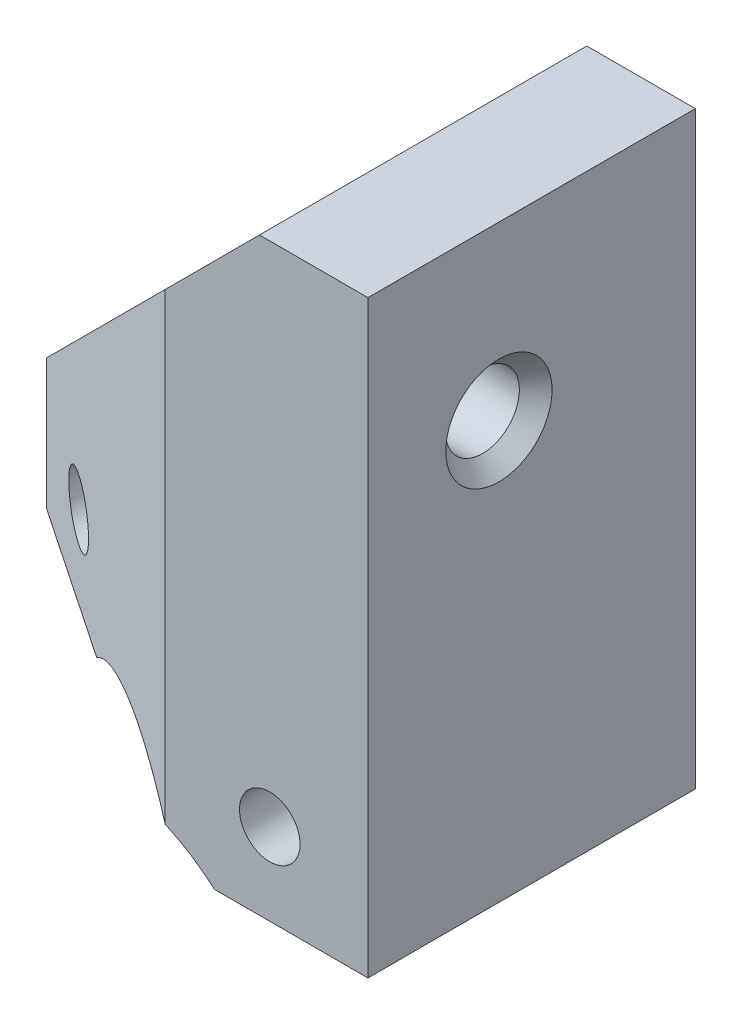
ISO-10303-21;
HEADER;
FILE_DESCRIPTION(('STEP AP214'),'2;1');
FILE_NAME('part.step','',(''),(''),'','','');
FILE_SCHEMA(('AUTOMOTIVE_DESIGN { 1 0 10303 214 1 1 1 1 }'));
ENDSEC;
DATA;
#1=APPLICATION_CONTEXT('core data for automotive mechanical design processes');
#2=APPLICATION_PROTOCOL_DEFINITION('international standard','automotive_design',2000,#1);
#3=PRODUCT_CONTEXT('',#1,'mechanical');
#4=PRODUCT('Part','Part','',(#3));
#5=PRODUCT_RELATED_PRODUCT_CATEGORY('part','',(#4));
#6=PRODUCT_DEFINITION_FORMATION('','',#4);
#7=PRODUCT_DEFINITION_CONTEXT('part definition',#1,'design');
#8=PRODUCT_DEFINITION('design','',#6,#7);
#9=PRODUCT_DEFINITION_SHAPE('','',#8);
#10=(LENGTH_UNIT() NAMED_UNIT(*) SI_UNIT(.MILLI.,.METRE.));
#11=(NAMED_UNIT(*) PLANE_ANGLE_UNIT() SI_UNIT($,.RADIAN.));
#12=(NAMED_UNIT(*) SI_UNIT($,.STERADIAN.) SOLID_ANGLE_UNIT());
#13=UNCERTAINTY_MEASURE_WITH_UNIT(LENGTH_MEASURE(1.E-05),#10,'distance_accuracy_value','');
#14=(GEOMETRIC_REPRESENTATION_CONTEXT(3) GLOBAL_UNCERTAINTY_ASSIGNED_CONTEXT((#13)) GLOBAL_UNIT_ASSIGNED_CONTEXT((#10,
#11,#12)) REPRESENTATION_CONTEXT('',''));
#15=CARTESIAN_POINT('',(0.,0.,0.));
#16=DIRECTION('',(0.,0.,1.));
#17=DIRECTION('',(1.,0.,0.));
#18=AXIS2_PLACEMENT_3D('',#15,#16,#17);
#19=CARTESIAN_POINT('',(-17.315,-5.,20.));
#20=DIRECTION('',(0.,1.,0.));
#21=DIRECTION('',(-1.,0.,0.));
#22=AXIS2_PLACEMENT_3D('',#19,#20,#21);
#23=PLANE('',#22);
#24=DIRECTION('',(0.,0.,1.));
#25=VECTOR('',#24,1.);
#26=CARTESIAN_POINT('',(-7.93725393319377,-5.,0.));
#27=LINE('',#26,#25);
#28=CARTESIAN_POINT('',(-7.93725393319377,-5.,0.));
#29=VERTEX_POINT('',#28);
#30=CARTESIAN_POINT('',(-7.93725393319377,-5.,11.3253695908464));
#31=VERTEX_POINT('',#30);
#32=EDGE_CURVE('E166',#29,#31,#27,.T.);
#33=ORIENTED_EDGE('',*,*,#32,.T.);
#34=DIRECTION('',(-0.829037572555041,0.,-0.559192903470748));
#35=VECTOR('',#34,1.);
#36=CARTESIAN_POINT('',(4.92341452769108,-5.,20.));
#37=LINE('',#36,#35);
#38=CARTESIAN_POINT('',(-17.315,-5.,4.99999999999997));
#39=VERTEX_POINT('',#38);
#40=EDGE_CURVE('E56',#31,#39,#37,.T.);
#41=ORIENTED_EDGE('',*,*,#40,.T.);
#42=DIRECTION('',(0.,0.,-1.));
#43=VECTOR('',#42,1.);
#44=CARTESIAN_POINT('',(-17.315,-5.,20.));
#45=LINE('',#44,#43);
#46=CARTESIAN_POINT('',(-17.315,-5.,0.));
#47=VERTEX_POINT('',#46);
#48=EDGE_CURVE('E149',#39,#47,#45,.T.);
#49=ORIENTED_EDGE('',*,*,#48,.T.);
#50=DIRECTION('',(1.,0.,0.));
#51=VECTOR('',#50,1.);
#52=CARTESIAN_POINT('',(-17.315,-5.,0.));
#53=LINE('',#52,#51);
#54=EDGE_CURVE('E122',#47,#29,#53,.T.);
#55=ORIENTED_EDGE('',*,*,#54,.T.);
#56=EDGE_LOOP('',(#33,#41,#49,#55));
#57=FACE_BOUND('',#56,.T.);
#58=ADVANCED_FACE('F33',(#57),#23,.F.);
#59=CARTESIAN_POINT('',(0.,0.,20.));
#60=DIRECTION('',(0.,0.,1.));
#61=DIRECTION('',(1.,0.,0.));
#62=AXIS2_PLACEMENT_3D('',#59,#60,#61);
#63=PLANE('',#62);
#64=DIRECTION('',(-0.707106781186546,-0.707106781186549,0.));
#65=VECTOR('',#64,1.);
#66=CARTESIAN_POINT('',(-10.1575,10.1574999999999,20.));
#67=LINE('',#66,#65);
#68=CARTESIAN_POINT('',(10.685,31.,20.));
#69=VERTEX_POINT('',#68);
#70=CARTESIAN_POINT('',(4.92341452769107,25.2384145276911,20.));
#71=VERTEX_POINT('',#70);
#72=EDGE_CURVE('E175',#69,#71,#67,.T.);
#73=ORIENTED_EDGE('',*,*,#72,.T.);
#74=DIRECTION('',(0.,-1.,0.));
#75=VECTOR('',#74,1.);
#76=CARTESIAN_POINT('',(4.92341452769108,-5.,20.));
#77=LINE('',#76,#75);
#78=CARTESIAN_POINT('',(4.92341452769108,-3.05650926858708,20.));
#79=VERTEX_POINT('',#78);
#80=EDGE_CURVE('E181',#71,#79,#77,.T.);
#81=ORIENTED_EDGE('',*,*,#80,.T.);
#82=CARTESIAN_POINT('',(0.,-14.,20.));
#83=DIRECTION('',(0.,0.,1.));
#84=DIRECTION('',(1.,0.,0.));
#85=AXIS2_PLACEMENT_3D('',#82,#83,#84);
#86=CIRCLE('',#85,12.);
#87=CARTESIAN_POINT('',(7.93725393319378,-5.,20.));
#88=VERTEX_POINT('',#87);
#89=EDGE_CURVE('E127',#88,#79,#86,.T.);
#90=ORIENTED_EDGE('',*,*,#89,.F.);
#91=DIRECTION('',(1.,0.,0.));
#92=VECTOR('',#91,1.);
#93=CARTESIAN_POINT('',(-17.315,-5.,20.));
#94=LINE('',#93,#92);
#95=CARTESIAN_POINT('',(17.315,-5.,20.));
#96=VERTEX_POINT('',#95);
#97=EDGE_CURVE('E118',#88,#96,#94,.T.);
#98=ORIENTED_EDGE('',*,*,#97,.T.);
#99=DIRECTION('',(0.,1.,0.));
#100=VECTOR('',#99,1.);
#101=CARTESIAN_POINT('',(17.315,5.,20.));
#102=LINE('',#101,#100);
#103=CARTESIAN_POINT('',(17.315,31.,20.));
#104=VERTEX_POINT('',#103);
#105=EDGE_CURVE('E113',#96,#104,#102,.T.);
#106=ORIENTED_EDGE('',*,*,#105,.T.);
#107=DIRECTION('',(1.,0.,0.));
#108=VECTOR('',#107,1.);
#109=CARTESIAN_POINT('',(-17.315,31.,20.));
#110=LINE('',#109,#108);
#111=EDGE_CURVE('E99',#69,#104,#110,.T.);
#112=ORIENTED_EDGE('',*,*,#111,.F.);
#113=EDGE_LOOP('',(#73,#81,#90,#98,#106,#112));
#114=FACE_BOUND('',#113,.T.);
#115=CARTESIAN_POINT('',(11.315,0.,20.));
#116=DIRECTION('',(0.,0.,1.));
#117=DIRECTION('',(1.,0.,0.));
#118=AXIS2_PLACEMENT_3D('',#115,#116,#117);
#119=CIRCLE('',#118,1.85);
#120=CARTESIAN_POINT('',(13.165,0.,20.));
#121=VERTEX_POINT('',#120);
#122=EDGE_CURVE('E135',#121,#121,#119,.T.);
#123=ORIENTED_EDGE('',*,*,#122,.F.);
#124=EDGE_LOOP('',(#123));
#125=FACE_BOUND('',#124,.T.);
#126=ADVANCED_FACE('F114',(#114,#125),#63,.T.);
#127=CARTESIAN_POINT('',(0.,0.,0.));
#128=DIRECTION('',(0.,0.,1.));
#129=DIRECTION('',(1.,0.,0.));
#130=AXIS2_PLACEMENT_3D('',#127,#128,#129);
#131=PLANE('',#130);
#132=CARTESIAN_POINT('',(-11.315,0.,0.));
#133=DIRECTION('',(0.,0.,1.));
#134=DIRECTION('',(1.,0.,0.));
#135=AXIS2_PLACEMENT_3D('',#132,#133,#134);
#136=CIRCLE('',#135,2.85);
#137=CARTESIAN_POINT('',(-8.465,0.,0.));
#138=VERTEX_POINT('',#137);
#139=EDGE_CURVE('E154',#138,#138,#136,.T.);
#140=ORIENTED_EDGE('',*,*,#139,.T.);
#141=EDGE_LOOP('',(#140));
#142=FACE_BOUND('',#141,.T.);
#143=CARTESIAN_POINT('',(11.315,0.,0.));
#144=DIRECTION('',(0.,0.,1.));
#145=DIRECTION('',(1.,0.,0.));
#146=AXIS2_PLACEMENT_3D('',#143,#144,#145);
#147=CIRCLE('',#146,2.85);
#148=CARTESIAN_POINT('',(14.165,0.,0.));
#149=VERTEX_POINT('',#148);
#150=EDGE_CURVE('E151',#149,#149,#147,.T.);
#151=ORIENTED_EDGE('',*,*,#150,.T.);
#152=EDGE_LOOP('',(#151));
#153=FACE_BOUND('',#152,.T.);
#154=DIRECTION('',(0.,-1.,0.));
#155=VECTOR('',#154,1.);
#156=CARTESIAN_POINT('',(-17.315,5.,0.));
#157=LINE('',#156,#155);
#158=CARTESIAN_POINT('',(-17.315,2.9999999999999,0.));
#159=VERTEX_POINT('',#158);
#160=EDGE_CURVE('E142',#159,#47,#157,.T.);
#161=ORIENTED_EDGE('',*,*,#160,.F.);
#162=DIRECTION('',(0.707106781186546,0.707106781186549,0.));
#163=VECTOR('',#162,1.);
#164=CARTESIAN_POINT('',(10.685,31.,0.));
#165=LINE('',#164,#163);
#166=CARTESIAN_POINT('',(10.685,31.,0.));
#167=VERTEX_POINT('',#166);
#168=EDGE_CURVE('E179',#159,#167,#165,.T.);
#169=ORIENTED_EDGE('',*,*,#168,.T.);
#170=DIRECTION('',(-1.,0.,0.));
#171=VECTOR('',#170,1.);
#172=CARTESIAN_POINT('',(17.315,31.,0.));
#173=LINE('',#172,#171);
#174=CARTESIAN_POINT('',(17.315,31.,0.));
#175=VERTEX_POINT('',#174);
#176=EDGE_CURVE('E110',#175,#167,#173,.T.);
#177=ORIENTED_EDGE('',*,*,#176,.F.);
#178=DIRECTION('',(0.,1.,0.));
#179=VECTOR('',#178,1.);
#180=CARTESIAN_POINT('',(17.315,5.,0.));
#181=LINE('',#180,#179);
#182=CARTESIAN_POINT('',(17.315,-5.,0.));
#183=VERTEX_POINT('',#182);
#184=EDGE_CURVE('E126',#183,#175,#181,.T.);
#185=ORIENTED_EDGE('',*,*,#184,.F.);
#186=CARTESIAN_POINT('',(7.93725393319377,-5.,0.));
#187=VERTEX_POINT('',#186);
#188=EDGE_CURVE('E145',#187,#183,#53,.T.);
#189=ORIENTED_EDGE('',*,*,#188,.F.);
#190=CARTESIAN_POINT('',(0.,-14.,0.));
#191=DIRECTION('',(0.,0.,1.));
#192=DIRECTION('',(1.,0.,0.));
#193=AXIS2_PLACEMENT_3D('',#190,#191,#192);
#194=CIRCLE('',#193,12.);
#195=EDGE_CURVE('E130',#187,#29,#194,.T.);
#196=ORIENTED_EDGE('',*,*,#195,.T.);
#197=ORIENTED_EDGE('',*,*,#54,.F.);
#198=EDGE_LOOP('',(#161,#169,#177,#185,#189,#196,#197));
#199=FACE_BOUND('',#198,.T.);
#200=ADVANCED_FACE('F206',(#142,#153,#199),#131,.F.);
#201=CARTESIAN_POINT('',(17.315,5.,20.));
#202=DIRECTION('',(-1.,0.,0.));
#203=DIRECTION('',(0.,0.,1.));
#204=AXIS2_PLACEMENT_3D('',#201,#202,#203);
#205=PLANE('',#204);
#206=CARTESIAN_POINT('',(17.315,20.5,12.));
#207=DIRECTION('',(-1.,0.,0.));
#208=DIRECTION('',(0.,0.,1.));
#209=AXIS2_PLACEMENT_3D('',#206,#207,#208);
#210=CIRCLE('',#209,3.25000000000001);
#211=CARTESIAN_POINT('',(17.315,20.5,15.25));
#212=VERTEX_POINT('',#211);
#213=EDGE_CURVE('E171',#212,#212,#210,.T.);
#214=ORIENTED_EDGE('',*,*,#213,.T.);
#215=EDGE_LOOP('',(#214));
#216=FACE_BOUND('',#215,.T.);
#217=ORIENTED_EDGE('',*,*,#184,.T.);
#218=DIRECTION('',(0.,0.,-1.));
#219=VECTOR('',#218,1.);
#220=CARTESIAN_POINT('',(17.315,31.,20.));
#221=LINE('',#220,#219);
#222=EDGE_CURVE('E104',#104,#175,#221,.T.);
#223=ORIENTED_EDGE('',*,*,#222,.F.);
#224=ORIENTED_EDGE('',*,*,#105,.F.);
#225=DIRECTION('',(0.,0.,-1.));
#226=VECTOR('',#225,1.);
#227=CARTESIAN_POINT('',(17.315,-5.,20.));
#228=LINE('',#227,#226);
#229=EDGE_CURVE('E140',#96,#183,#228,.T.);
#230=ORIENTED_EDGE('',*,*,#229,.T.);
#231=EDGE_LOOP('',(#217,#223,#224,#230));
#232=FACE_BOUND('',#231,.T.);
#233=ADVANCED_FACE('F124',(#216,#232),#205,.F.);
#234=CARTESIAN_POINT('',(-17.315,5.,20.));
#235=DIRECTION('',(1.,0.,0.));
#236=DIRECTION('',(0.,0.,-1.));
#237=AXIS2_PLACEMENT_3D('',#234,#235,#236);
#238=PLANE('',#237);
#239=ORIENTED_EDGE('',*,*,#48,.F.);
#240=DIRECTION('',(0.,1.,0.));
#241=VECTOR('',#240,1.);
#242=CARTESIAN_POINT('',(-17.315,2.9999999999999,4.99999999999997));
#243=LINE('',#242,#241);
#244=CARTESIAN_POINT('',(-17.315,2.9999999999999,4.99999999999997));
#245=VERTEX_POINT('',#244);
#246=EDGE_CURVE('E42',#39,#245,#243,.T.);
#247=ORIENTED_EDGE('',*,*,#246,.T.);
#248=DIRECTION('',(0.,0.,-1.));
#249=VECTOR('',#248,1.);
#250=CARTESIAN_POINT('',(-17.315,2.9999999999999,0.));
#251=LINE('',#250,#249);
#252=EDGE_CURVE('E177',#245,#159,#251,.T.);
#253=ORIENTED_EDGE('',*,*,#252,.T.);
#254=ORIENTED_EDGE('',*,*,#160,.T.);
#255=EDGE_LOOP('',(#239,#247,#253,#254));
#256=FACE_BOUND('',#255,.T.);
#257=ADVANCED_FACE('F207',(#256),#238,.F.);
#258=ORIENTED_EDGE('',*,*,#97,.F.);
#259=DIRECTION('',(0.,0.,1.));
#260=VECTOR('',#259,1.);
#261=CARTESIAN_POINT('',(7.93725393319378,-5.,0.));
#262=LINE('',#261,#260);
#263=EDGE_CURVE('E163',#88,#187,#262,.F.);
#264=ORIENTED_EDGE('',*,*,#263,.T.);
#265=ORIENTED_EDGE('',*,*,#188,.T.);
#266=ORIENTED_EDGE('',*,*,#229,.F.);
#267=EDGE_LOOP('',(#258,#264,#265,#266));
#268=FACE_BOUND('',#267,.T.);
#269=ADVANCED_FACE('F202',(#268),#23,.F.);
#270=CARTESIAN_POINT('',(-11.315,0.,20.));
#271=DIRECTION('',(0.,0.,-1.));
#272=DIRECTION('',(-1.,0.,0.));
#273=AXIS2_PLACEMENT_3D('',#270,#271,#272);
#274=CYLINDRICAL_SURFACE('',#273,1.85);
#275=CARTESIAN_POINT('',(-11.315,0.,1.));
#276=DIRECTION('',(0.,0.,1.));
#277=DIRECTION('',(1.,0.,0.));
#278=AXIS2_PLACEMENT_3D('',#275,#276,#277);
#279=CIRCLE('',#278,1.85);
#280=CARTESIAN_POINT('',(-9.465,0.,1.));
#281=VERTEX_POINT('',#280);
#282=EDGE_CURVE('E157',#281,#281,#279,.F.);
#283=ORIENTED_EDGE('',*,*,#282,.T.);
#284=EDGE_LOOP('',(#283));
#285=FACE_BOUND('',#284,.T.);
#286=CARTESIAN_POINT('',(-11.315,0.,9.04705110105455));
#287=DIRECTION('',(-0.559192903470748,0.,0.829037572555041));
#288=DIRECTION('',(-0.829037572555041,0.,-0.559192903470748));
#289=AXIS2_PLACEMENT_3D('',#286,#287,#288);
#290=ELLIPSE('',#289,2.23150320473223,1.85);
#291=CARTESIAN_POINT('',(-13.165,0.,7.79921034489605));
#292=VERTEX_POINT('',#291);
#293=EDGE_CURVE('E37',#292,#292,#290,.T.);
#294=ORIENTED_EDGE('',*,*,#293,.T.);
#295=EDGE_LOOP('',(#294));
#296=FACE_BOUND('',#295,.T.);
#297=ADVANCED_FACE('F214',(#285,#296),#274,.F.);
#298=CARTESIAN_POINT('',(11.315,0.,20.));
#299=DIRECTION('',(0.,0.,-1.));
#300=DIRECTION('',(-1.,0.,0.));
#301=AXIS2_PLACEMENT_3D('',#298,#299,#300);
#302=CYLINDRICAL_SURFACE('',#301,1.85);
#303=CARTESIAN_POINT('',(11.315,0.,1.));
#304=DIRECTION('',(0.,0.,1.));
#305=DIRECTION('',(1.,0.,0.));
#306=AXIS2_PLACEMENT_3D('',#303,#304,#305);
#307=CIRCLE('',#306,1.85);
#308=CARTESIAN_POINT('',(13.165,0.,1.));
#309=VERTEX_POINT('',#308);
#310=EDGE_CURVE('E160',#309,#309,#307,.F.);
#311=ORIENTED_EDGE('',*,*,#310,.T.);
#312=EDGE_LOOP('',(#311));
#313=FACE_BOUND('',#312,.T.);
#314=ORIENTED_EDGE('',*,*,#122,.T.);
#315=EDGE_LOOP('',(#314));
#316=FACE_BOUND('',#315,.T.);
#317=ADVANCED_FACE('F229',(#313,#316),#302,.F.);
#318=CARTESIAN_POINT('',(-11.315,0.,0.));
#319=DIRECTION('',(0.,0.,-1.));
#320=DIRECTION('',(-1.,0.,0.));
#321=AXIS2_PLACEMENT_3D('',#318,#319,#320);
#322=CONICAL_SURFACE('',#321,2.85,0.785398163397446);
#323=ORIENTED_EDGE('',*,*,#282,.F.);
#324=EDGE_LOOP('',(#323));
#325=FACE_BOUND('',#324,.T.);
#326=ORIENTED_EDGE('',*,*,#139,.F.);
#327=EDGE_LOOP('',(#326));
#328=FACE_BOUND('',#327,.T.);
#329=ADVANCED_FACE('F233',(#325,#328),#322,.F.);
#330=CARTESIAN_POINT('',(11.315,0.,0.));
#331=DIRECTION('',(0.,0.,-1.));
#332=DIRECTION('',(-1.,0.,0.));
#333=AXIS2_PLACEMENT_3D('',#330,#331,#332);
#334=CONICAL_SURFACE('',#333,2.85,0.785398163397446);
#335=ORIENTED_EDGE('',*,*,#310,.F.);
#336=EDGE_LOOP('',(#335));
#337=FACE_BOUND('',#336,.T.);
#338=ORIENTED_EDGE('',*,*,#150,.F.);
#339=EDGE_LOOP('',(#338));
#340=FACE_BOUND('',#339,.T.);
#341=ADVANCED_FACE('F237',(#337,#340),#334,.F.);
#342=CARTESIAN_POINT('',(0.,-14.,0.));
#343=DIRECTION('',(0.,0.,1.));
#344=DIRECTION('',(1.,0.,0.));
#345=AXIS2_PLACEMENT_3D('',#342,#343,#344);
#346=CYLINDRICAL_SURFACE('',#345,12.);
#347=ORIENTED_EDGE('',*,*,#89,.T.);
#348=CARTESIAN_POINT('',(0.,-14.,16.6791149691266));
#349=DIRECTION('',(-0.559192903470748,0.,0.829037572555041));
#350=DIRECTION('',(0.829037572555041,0.,0.559192903470748));
#351=AXIS2_PLACEMENT_3D('',#348,#349,#350);
#352=ELLIPSE('',#351,14.4746153820469,12.);
#353=EDGE_CURVE('E187',#79,#31,#352,.T.);
#354=ORIENTED_EDGE('',*,*,#353,.T.);
#355=ORIENTED_EDGE('',*,*,#32,.F.);
#356=ORIENTED_EDGE('',*,*,#195,.F.);
#357=ORIENTED_EDGE('',*,*,#263,.F.);
#358=EDGE_LOOP('',(#347,#354,#355,#356,#357));
#359=FACE_BOUND('',#358,.T.);
#360=ADVANCED_FACE('F191',(#359),#346,.F.);
#361=CARTESIAN_POINT('',(0.,31.,0.));
#362=DIRECTION('',(0.,1.,0.));
#363=DIRECTION('',(0.,0.,1.));
#364=AXIS2_PLACEMENT_3D('',#361,#362,#363);
#365=PLANE('',#364);
#366=ORIENTED_EDGE('',*,*,#176,.T.);
#367=DIRECTION('',(0.,0.,1.));
#368=VECTOR('',#367,1.);
#369=CARTESIAN_POINT('',(10.685,31.,20.));
#370=LINE('',#369,#368);
#371=EDGE_CURVE('E107',#167,#69,#370,.T.);
#372=ORIENTED_EDGE('',*,*,#371,.T.);
#373=ORIENTED_EDGE('',*,*,#111,.T.);
#374=ORIENTED_EDGE('',*,*,#222,.T.);
#375=EDGE_LOOP('',(#366,#372,#373,#374));
#376=FACE_BOUND('',#375,.T.);
#377=ADVANCED_FACE('F102',(#376),#365,.T.);
#378=CARTESIAN_POINT('',(-17.315,20.5,12.));
#379=DIRECTION('',(1.,0.,0.));
#380=DIRECTION('',(0.,0.,-1.));
#381=AXIS2_PLACEMENT_3D('',#378,#379,#380);
#382=CYLINDRICAL_SURFACE('',#381,2.25);
#383=CARTESIAN_POINT('',(16.315,20.5,12.));
#384=DIRECTION('',(-1.,0.,0.));
#385=DIRECTION('',(0.,0.,1.));
#386=AXIS2_PLACEMENT_3D('',#383,#384,#385);
#387=CIRCLE('',#386,2.25);
#388=CARTESIAN_POINT('',(16.315,20.5,14.25));
#389=VERTEX_POINT('',#388);
#390=EDGE_CURVE('E168',#389,#389,#387,.F.);
#391=ORIENTED_EDGE('',*,*,#390,.T.);
#392=EDGE_LOOP('',(#391));
#393=FACE_BOUND('',#392,.T.);
#394=CARTESIAN_POINT('',(0.185000000000039,20.5,12.));
#395=DIRECTION('',(-0.707106781186549,0.707106781186546,0.));
#396=DIRECTION('',(0.707106781186546,0.707106781186549,0.));
#397=AXIS2_PLACEMENT_3D('',#394,#395,#396);
#398=ELLIPSE('',#397,3.18198051533946,2.25);
#399=CARTESIAN_POINT('',(2.43500000000003,22.75,12.));
#400=VERTEX_POINT('',#399);
#401=EDGE_CURVE('E182',#400,#400,#398,.F.);
#402=ORIENTED_EDGE('',*,*,#401,.F.);
#403=EDGE_LOOP('',(#402));
#404=FACE_BOUND('',#403,.T.);
#405=ADVANCED_FACE('F240',(#393,#404),#382,.F.);
#406=CARTESIAN_POINT('',(16.315,20.5,12.));
#407=DIRECTION('',(1.,0.,0.));
#408=DIRECTION('',(0.,0.,-1.));
#409=AXIS2_PLACEMENT_3D('',#406,#407,#408);
#410=CONICAL_SURFACE('',#409,2.25,0.785398163397448);
#411=ORIENTED_EDGE('',*,*,#213,.F.);
#412=EDGE_LOOP('',(#411));
#413=FACE_BOUND('',#412,.T.);
#414=ORIENTED_EDGE('',*,*,#390,.F.);
#415=EDGE_LOOP('',(#414));
#416=FACE_BOUND('',#415,.T.);
#417=ADVANCED_FACE('F242',(#413,#416),#410,.F.);
#418=CARTESIAN_POINT('',(10.685,31.,0.));
#419=DIRECTION('',(-0.707106781186549,0.707106781186546,0.));
#420=DIRECTION('',(0.,0.,-1.));
#421=AXIS2_PLACEMENT_3D('',#418,#419,#420);
#422=PLANE('',#421);
#423=ORIENTED_EDGE('',*,*,#252,.F.);
#424=DIRECTION('',(0.638230619643253,0.638230619643255,0.430491988658995));
#425=VECTOR('',#424,1.);
#426=CARTESIAN_POINT('',(4.12218029224545,24.4371802922454,19.4595606842062));
#427=LINE('',#426,#425);
#428=EDGE_CURVE('E11',#245,#71,#427,.T.);
#429=ORIENTED_EDGE('',*,*,#428,.T.);
#430=ORIENTED_EDGE('',*,*,#72,.F.);
#431=ORIENTED_EDGE('',*,*,#371,.F.);
#432=ORIENTED_EDGE('',*,*,#168,.F.);
#433=EDGE_LOOP('',(#423,#429,#430,#431,#432));
#434=FACE_BOUND('',#433,.T.);
#435=ORIENTED_EDGE('',*,*,#401,.T.);
#436=EDGE_LOOP('',(#435));
#437=FACE_BOUND('',#436,.T.);
#438=ADVANCED_FACE('F198',(#434,#437),#422,.T.);
#439=CARTESIAN_POINT('',(4.92341452769108,0.,20.));
#440=DIRECTION('',(-0.559192903470748,0.,0.829037572555041));
#441=DIRECTION('',(0.,1.,0.));
#442=AXIS2_PLACEMENT_3D('',#439,#440,#441);
#443=PLANE('',#442);
#444=ORIENTED_EDGE('',*,*,#428,.F.);
#445=ORIENTED_EDGE('',*,*,#246,.F.);
#446=ORIENTED_EDGE('',*,*,#40,.F.);
#447=ORIENTED_EDGE('',*,*,#353,.F.);
#448=ORIENTED_EDGE('',*,*,#80,.F.);
#449=EDGE_LOOP('',(#444,#445,#446,#447,#448));
#450=FACE_BOUND('',#449,.T.);
#451=ORIENTED_EDGE('',*,*,#293,.F.);
#452=EDGE_LOOP('',(#451));
#453=FACE_BOUND('',#452,.T.);
#454=ADVANCED_FACE('F35',(#450,#453),#443,.T.);
#455=CLOSED_SHELL('',(#58,#126,#200,#233,#257,#269,#297,#317,#329,#341,#360,#377,#405,#417,#438,#454));
#456=MANIFOLD_SOLID_BREP('B2',#455);
#457=ADVANCED_BREP_SHAPE_REPRESENTATION('',(#18,#456),#14);
#458=SHAPE_DEFINITION_REPRESENTATION(#9,#457);
ENDSEC;
END-ISO-10303-21;
